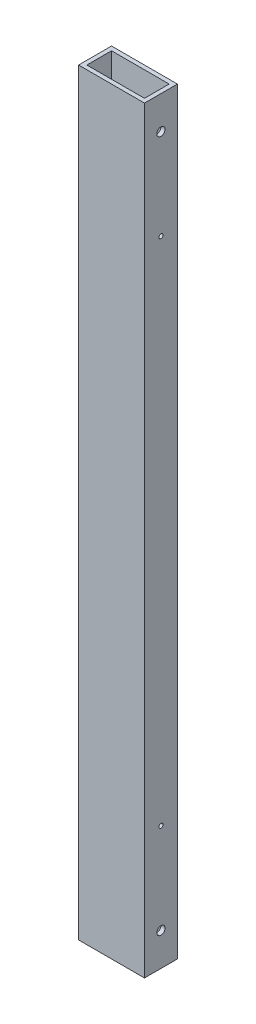
ISO-10303-21;
HEADER;
FILE_DESCRIPTION(('STEP AP214'),'2;1');
FILE_NAME('part.step','',(''),(''),'','','');
FILE_SCHEMA(('AUTOMOTIVE_DESIGN { 1 0 10303 214 1 1 1 1 }'));
ENDSEC;
DATA;
#1=APPLICATION_CONTEXT('core data for automotive mechanical design processes');
#2=APPLICATION_PROTOCOL_DEFINITION('international standard','automotive_design',2000,#1);
#3=PRODUCT_CONTEXT('',#1,'mechanical');
#4=PRODUCT('Part','Part','',(#3));
#5=PRODUCT_RELATED_PRODUCT_CATEGORY('part','',(#4));
#6=PRODUCT_DEFINITION_FORMATION('','',#4);
#7=PRODUCT_DEFINITION_CONTEXT('part definition',#1,'design');
#8=PRODUCT_DEFINITION('design','',#6,#7);
#9=PRODUCT_DEFINITION_SHAPE('','',#8);
#10=(LENGTH_UNIT() NAMED_UNIT(*) SI_UNIT(.MILLI.,.METRE.));
#11=(NAMED_UNIT(*) PLANE_ANGLE_UNIT() SI_UNIT($,.RADIAN.));
#12=(NAMED_UNIT(*) SI_UNIT($,.STERADIAN.) SOLID_ANGLE_UNIT());
#13=UNCERTAINTY_MEASURE_WITH_UNIT(LENGTH_MEASURE(1.E-05),#10,'distance_accuracy_value','');
#14=(GEOMETRIC_REPRESENTATION_CONTEXT(3) GLOBAL_UNCERTAINTY_ASSIGNED_CONTEXT((#13)) GLOBAL_UNIT_ASSIGNED_CONTEXT((#10,
#11,#12)) REPRESENTATION_CONTEXT('',''));
#15=CARTESIAN_POINT('',(0.,0.,0.));
#16=DIRECTION('',(0.,0.,1.));
#17=DIRECTION('',(1.,0.,0.));
#18=AXIS2_PLACEMENT_3D('',#15,#16,#17);
#19=CARTESIAN_POINT('',(0.,584.2,0.));
#20=DIRECTION('',(0.,-1.,0.));
#21=DIRECTION('',(0.,0.,-1.));
#22=AXIS2_PLACEMENT_3D('',#19,#20,#21);
#23=PLANE('',#22);
#24=DIRECTION('',(0.,0.,1.));
#25=VECTOR('',#24,1.);
#26=CARTESIAN_POINT('',(-3.175,584.2,3.175));
#27=LINE('',#26,#25);
#28=CARTESIAN_POINT('',(-3.175,584.2,-22.225));
#29=VERTEX_POINT('',#28);
#30=CARTESIAN_POINT('',(-3.175,584.2,3.175));
#31=VERTEX_POINT('',#30);
#32=EDGE_CURVE('E137',#29,#31,#27,.T.);
#33=ORIENTED_EDGE('',*,*,#32,.T.);
#34=DIRECTION('',(1.,0.,0.));
#35=VECTOR('',#34,1.);
#36=CARTESIAN_POINT('',(-3.175,584.2,3.175));
#37=LINE('',#36,#35);
#38=CARTESIAN_POINT('',(47.625,584.2,3.175));
#39=VERTEX_POINT('',#38);
#40=EDGE_CURVE('E140',#31,#39,#37,.T.);
#41=ORIENTED_EDGE('',*,*,#40,.T.);
#42=DIRECTION('',(0.,0.,-1.));
#43=VECTOR('',#42,1.);
#44=CARTESIAN_POINT('',(47.625,584.2,3.175));
#45=LINE('',#44,#43);
#46=CARTESIAN_POINT('',(47.625,584.2,-22.225));
#47=VERTEX_POINT('',#46);
#48=EDGE_CURVE('E143',#39,#47,#45,.T.);
#49=ORIENTED_EDGE('',*,*,#48,.T.);
#50=DIRECTION('',(-1.,0.,0.));
#51=VECTOR('',#50,1.);
#52=CARTESIAN_POINT('',(-3.175,584.2,-22.225));
#53=LINE('',#52,#51);
#54=EDGE_CURVE('E145',#47,#29,#53,.T.);
#55=ORIENTED_EDGE('',*,*,#54,.T.);
#56=EDGE_LOOP('',(#33,#41,#49,#55));
#57=FACE_BOUND('',#56,.T.);
#58=DIRECTION('',(0.,0.,1.));
#59=VECTOR('',#58,1.);
#60=CARTESIAN_POINT('',(0.,584.2,0.));
#61=LINE('',#60,#59);
#62=CARTESIAN_POINT('',(0.,584.2,-19.05));
#63=VERTEX_POINT('',#62);
#64=CARTESIAN_POINT('',(0.,584.2,0.));
#65=VERTEX_POINT('',#64);
#66=EDGE_CURVE('E99',#63,#65,#61,.T.);
#67=ORIENTED_EDGE('',*,*,#66,.F.);
#68=DIRECTION('',(-1.,0.,0.));
#69=VECTOR('',#68,1.);
#70=CARTESIAN_POINT('',(0.,584.2,-19.05));
#71=LINE('',#70,#69);
#72=CARTESIAN_POINT('',(44.45,584.2,-19.05));
#73=VERTEX_POINT('',#72);
#74=EDGE_CURVE('E121',#73,#63,#71,.T.);
#75=ORIENTED_EDGE('',*,*,#74,.F.);
#76=DIRECTION('',(0.,0.,-1.));
#77=VECTOR('',#76,1.);
#78=CARTESIAN_POINT('',(44.45,584.2,0.));
#79=LINE('',#78,#77);
#80=CARTESIAN_POINT('',(44.45,584.2,0.));
#81=VERTEX_POINT('',#80);
#82=EDGE_CURVE('E119',#81,#73,#79,.T.);
#83=ORIENTED_EDGE('',*,*,#82,.F.);
#84=DIRECTION('',(1.,0.,0.));
#85=VECTOR('',#84,1.);
#86=CARTESIAN_POINT('',(0.,584.2,0.));
#87=LINE('',#86,#85);
#88=EDGE_CURVE('E107',#65,#81,#87,.T.);
#89=ORIENTED_EDGE('',*,*,#88,.F.);
#90=EDGE_LOOP('',(#67,#75,#83,#89));
#91=FACE_BOUND('',#90,.T.);
#92=ADVANCED_FACE('F32',(#57,#91),#23,.F.);
#93=CARTESIAN_POINT('',(0.,0.,0.));
#94=DIRECTION('',(0.,-1.,0.));
#95=DIRECTION('',(0.,0.,-1.));
#96=AXIS2_PLACEMENT_3D('',#93,#94,#95);
#97=PLANE('',#96);
#98=DIRECTION('',(0.,0.,1.));
#99=VECTOR('',#98,1.);
#100=CARTESIAN_POINT('',(-3.175,0.,3.175));
#101=LINE('',#100,#99);
#102=CARTESIAN_POINT('',(-3.175,0.,-22.225));
#103=VERTEX_POINT('',#102);
#104=CARTESIAN_POINT('',(-3.175,0.,3.175));
#105=VERTEX_POINT('',#104);
#106=EDGE_CURVE('E115',#103,#105,#101,.T.);
#107=ORIENTED_EDGE('',*,*,#106,.F.);
#108=DIRECTION('',(-1.,0.,0.));
#109=VECTOR('',#108,1.);
#110=CARTESIAN_POINT('',(-3.175,0.,-22.225));
#111=LINE('',#110,#109);
#112=CARTESIAN_POINT('',(47.625,0.,-22.225));
#113=VERTEX_POINT('',#112);
#114=EDGE_CURVE('E141',#113,#103,#111,.T.);
#115=ORIENTED_EDGE('',*,*,#114,.F.);
#116=DIRECTION('',(0.,0.,-1.));
#117=VECTOR('',#116,1.);
#118=CARTESIAN_POINT('',(47.625,0.,3.175));
#119=LINE('',#118,#117);
#120=CARTESIAN_POINT('',(47.625,0.,3.175));
#121=VERTEX_POINT('',#120);
#122=EDGE_CURVE('E152',#121,#113,#119,.T.);
#123=ORIENTED_EDGE('',*,*,#122,.F.);
#124=DIRECTION('',(1.,0.,0.));
#125=VECTOR('',#124,1.);
#126=CARTESIAN_POINT('',(-3.175,0.,3.175));
#127=LINE('',#126,#125);
#128=EDGE_CURVE('E150',#105,#121,#127,.T.);
#129=ORIENTED_EDGE('',*,*,#128,.F.);
#130=EDGE_LOOP('',(#107,#115,#123,#129));
#131=FACE_BOUND('',#130,.T.);
#132=DIRECTION('',(-1.,0.,0.));
#133=VECTOR('',#132,1.);
#134=CARTESIAN_POINT('',(0.,0.,-19.05));
#135=LINE('',#134,#133);
#136=CARTESIAN_POINT('',(44.45,0.,-19.05));
#137=VERTEX_POINT('',#136);
#138=CARTESIAN_POINT('',(0.,0.,-19.05));
#139=VERTEX_POINT('',#138);
#140=EDGE_CURVE('E108',#137,#139,#135,.T.);
#141=ORIENTED_EDGE('',*,*,#140,.T.);
#142=DIRECTION('',(0.,0.,1.));
#143=VECTOR('',#142,1.);
#144=CARTESIAN_POINT('',(0.,0.,0.));
#145=LINE('',#144,#143);
#146=CARTESIAN_POINT('',(0.,0.,0.));
#147=VERTEX_POINT('',#146);
#148=EDGE_CURVE('E57',#139,#147,#145,.T.);
#149=ORIENTED_EDGE('',*,*,#148,.T.);
#150=DIRECTION('',(1.,0.,0.));
#151=VECTOR('',#150,1.);
#152=CARTESIAN_POINT('',(0.,0.,0.));
#153=LINE('',#152,#151);
#154=CARTESIAN_POINT('',(44.45,0.,0.));
#155=VERTEX_POINT('',#154);
#156=EDGE_CURVE('E114',#147,#155,#153,.T.);
#157=ORIENTED_EDGE('',*,*,#156,.T.);
#158=DIRECTION('',(0.,0.,-1.));
#159=VECTOR('',#158,1.);
#160=CARTESIAN_POINT('',(44.45,0.,0.));
#161=LINE('',#160,#159);
#162=EDGE_CURVE('E129',#155,#137,#161,.T.);
#163=ORIENTED_EDGE('',*,*,#162,.T.);
#164=EDGE_LOOP('',(#141,#149,#157,#163));
#165=FACE_BOUND('',#164,.T.);
#166=ADVANCED_FACE('F225',(#131,#165),#97,.T.);
#167=CARTESIAN_POINT('',(-3.175,584.2,3.175));
#168=DIRECTION('',(1.,0.,0.));
#169=DIRECTION('',(0.,0.,-1.));
#170=AXIS2_PLACEMENT_3D('',#167,#168,#169);
#171=PLANE('',#170);
#172=CARTESIAN_POINT('',(-3.175,558.8,-9.525));
#173=DIRECTION('',(-1.,0.,0.));
#174=DIRECTION('',(0.,0.,1.));
#175=AXIS2_PLACEMENT_3D('',#172,#173,#174);
#176=CIRCLE('',#175,3.175);
#177=CARTESIAN_POINT('',(-3.175,558.8,-6.35));
#178=VERTEX_POINT('',#177);
#179=EDGE_CURVE('E295',#178,#178,#176,.T.);
#180=ORIENTED_EDGE('',*,*,#179,.F.);
#181=EDGE_LOOP('',(#180));
#182=FACE_BOUND('',#181,.T.);
#183=CARTESIAN_POINT('',(-3.175,25.4,-9.525));
#184=DIRECTION('',(-1.,0.,0.));
#185=DIRECTION('',(0.,0.,1.));
#186=AXIS2_PLACEMENT_3D('',#183,#184,#185);
#187=CIRCLE('',#186,3.175);
#188=CARTESIAN_POINT('',(-3.175,25.4,-6.35));
#189=VERTEX_POINT('',#188);
#190=EDGE_CURVE('E180',#189,#189,#187,.T.);
#191=ORIENTED_EDGE('',*,*,#190,.F.);
#192=EDGE_LOOP('',(#191));
#193=FACE_BOUND('',#192,.T.);
#194=CARTESIAN_POINT('',(-3.175,488.95,-9.52500000000001));
#195=DIRECTION('',(1.,0.,0.));
#196=DIRECTION('',(0.,0.,-1.));
#197=AXIS2_PLACEMENT_3D('',#194,#195,#196);
#198=CIRCLE('',#197,1.58750000000004);
#199=CARTESIAN_POINT('',(-3.175,488.95,-11.1125));
#200=VERTEX_POINT('',#199);
#201=EDGE_CURVE('E169',#200,#200,#198,.T.);
#202=ORIENTED_EDGE('',*,*,#201,.T.);
#203=EDGE_LOOP('',(#202));
#204=FACE_BOUND('',#203,.T.);
#205=CARTESIAN_POINT('',(-3.175,95.2500000000001,-9.52499999999995));
#206=DIRECTION('',(1.,0.,0.));
#207=DIRECTION('',(0.,0.,-1.));
#208=AXIS2_PLACEMENT_3D('',#205,#206,#207);
#209=CIRCLE('',#208,1.58750000000005);
#210=CARTESIAN_POINT('',(-3.175,95.2500000000001,-11.1125));
#211=VERTEX_POINT('',#210);
#212=EDGE_CURVE('E165',#211,#211,#209,.T.);
#213=ORIENTED_EDGE('',*,*,#212,.T.);
#214=EDGE_LOOP('',(#213));
#215=FACE_BOUND('',#214,.T.);
#216=ORIENTED_EDGE('',*,*,#106,.T.);
#217=DIRECTION('',(0.,-1.,0.));
#218=VECTOR('',#217,1.);
#219=CARTESIAN_POINT('',(-3.175,584.2,3.175));
#220=LINE('',#219,#218);
#221=EDGE_CURVE('E11',#31,#105,#220,.T.);
#222=ORIENTED_EDGE('',*,*,#221,.F.);
#223=ORIENTED_EDGE('',*,*,#32,.F.);
#224=DIRECTION('',(0.,-1.,0.));
#225=VECTOR('',#224,1.);
#226=CARTESIAN_POINT('',(-3.175,584.2,-22.225));
#227=LINE('',#226,#225);
#228=EDGE_CURVE('E147',#29,#103,#227,.T.);
#229=ORIENTED_EDGE('',*,*,#228,.T.);
#230=EDGE_LOOP('',(#216,#222,#223,#229));
#231=FACE_BOUND('',#230,.T.);
#232=ADVANCED_FACE('F34',(#182,#193,#204,#215,#231),#171,.F.);
#233=CARTESIAN_POINT('',(-3.175,584.2,3.175));
#234=DIRECTION('',(0.,0.,-1.));
#235=DIRECTION('',(-1.,0.,0.));
#236=AXIS2_PLACEMENT_3D('',#233,#234,#235);
#237=PLANE('',#236);
#238=ORIENTED_EDGE('',*,*,#128,.T.);
#239=DIRECTION('',(0.,-1.,0.));
#240=VECTOR('',#239,1.);
#241=CARTESIAN_POINT('',(47.625,584.2,3.175));
#242=LINE('',#241,#240);
#243=EDGE_CURVE('E41',#39,#121,#242,.T.);
#244=ORIENTED_EDGE('',*,*,#243,.F.);
#245=ORIENTED_EDGE('',*,*,#40,.F.);
#246=ORIENTED_EDGE('',*,*,#221,.T.);
#247=EDGE_LOOP('',(#238,#244,#245,#246));
#248=FACE_BOUND('',#247,.T.);
#249=ADVANCED_FACE('F233',(#248),#237,.F.);
#250=CARTESIAN_POINT('',(47.625,584.2,3.175));
#251=DIRECTION('',(-1.,0.,0.));
#252=DIRECTION('',(0.,0.,1.));
#253=AXIS2_PLACEMENT_3D('',#250,#251,#252);
#254=PLANE('',#253);
#255=CARTESIAN_POINT('',(47.625,558.8,-9.525));
#256=DIRECTION('',(-1.,0.,0.));
#257=DIRECTION('',(0.,0.,1.));
#258=AXIS2_PLACEMENT_3D('',#255,#256,#257);
#259=CIRCLE('',#258,3.175);
#260=CARTESIAN_POINT('',(47.625,558.8,-6.35));
#261=VERTEX_POINT('',#260);
#262=EDGE_CURVE('E294',#261,#261,#259,.T.);
#263=ORIENTED_EDGE('',*,*,#262,.T.);
#264=EDGE_LOOP('',(#263));
#265=FACE_BOUND('',#264,.T.);
#266=CARTESIAN_POINT('',(47.625,25.4,-9.525));
#267=DIRECTION('',(-1.,0.,0.));
#268=DIRECTION('',(0.,0.,1.));
#269=AXIS2_PLACEMENT_3D('',#266,#267,#268);
#270=CIRCLE('',#269,3.175);
#271=CARTESIAN_POINT('',(47.625,25.4,-6.35));
#272=VERTEX_POINT('',#271);
#273=EDGE_CURVE('E173',#272,#272,#270,.T.);
#274=ORIENTED_EDGE('',*,*,#273,.T.);
#275=EDGE_LOOP('',(#274));
#276=FACE_BOUND('',#275,.T.);
#277=CARTESIAN_POINT('',(47.625,488.95,-9.52500000000001));
#278=DIRECTION('',(1.,0.,0.));
#279=DIRECTION('',(0.,0.,-1.));
#280=AXIS2_PLACEMENT_3D('',#277,#278,#279);
#281=CIRCLE('',#280,1.58750000000004);
#282=CARTESIAN_POINT('',(47.625,488.95,-11.1125));
#283=VERTEX_POINT('',#282);
#284=EDGE_CURVE('E177',#283,#283,#281,.T.);
#285=ORIENTED_EDGE('',*,*,#284,.F.);
#286=EDGE_LOOP('',(#285));
#287=FACE_BOUND('',#286,.T.);
#288=CARTESIAN_POINT('',(47.625,95.2500000000001,-9.52499999999995));
#289=DIRECTION('',(1.,0.,0.));
#290=DIRECTION('',(0.,0.,-1.));
#291=AXIS2_PLACEMENT_3D('',#288,#289,#290);
#292=CIRCLE('',#291,1.58750000000005);
#293=CARTESIAN_POINT('',(47.625,95.2500000000001,-11.1125));
#294=VERTEX_POINT('',#293);
#295=EDGE_CURVE('E196',#294,#294,#292,.T.);
#296=ORIENTED_EDGE('',*,*,#295,.F.);
#297=EDGE_LOOP('',(#296));
#298=FACE_BOUND('',#297,.T.);
#299=ORIENTED_EDGE('',*,*,#122,.T.);
#300=DIRECTION('',(0.,-1.,0.));
#301=VECTOR('',#300,1.);
#302=CARTESIAN_POINT('',(47.625,584.2,-22.225));
#303=LINE('',#302,#301);
#304=EDGE_CURVE('E157',#47,#113,#303,.T.);
#305=ORIENTED_EDGE('',*,*,#304,.F.);
#306=ORIENTED_EDGE('',*,*,#48,.F.);
#307=ORIENTED_EDGE('',*,*,#243,.T.);
#308=EDGE_LOOP('',(#299,#305,#306,#307));
#309=FACE_BOUND('',#308,.T.);
#310=ADVANCED_FACE('F218',(#265,#276,#287,#298,#309),#254,.F.);
#311=CARTESIAN_POINT('',(-3.175,584.2,-22.225));
#312=DIRECTION('',(0.,0.,1.));
#313=DIRECTION('',(1.,0.,0.));
#314=AXIS2_PLACEMENT_3D('',#311,#312,#313);
#315=PLANE('',#314);
#316=ORIENTED_EDGE('',*,*,#114,.T.);
#317=ORIENTED_EDGE('',*,*,#228,.F.);
#318=ORIENTED_EDGE('',*,*,#54,.F.);
#319=ORIENTED_EDGE('',*,*,#304,.T.);
#320=EDGE_LOOP('',(#316,#317,#318,#319));
#321=FACE_BOUND('',#320,.T.);
#322=ADVANCED_FACE('F207',(#321),#315,.F.);
#323=CARTESIAN_POINT('',(0.,584.2,0.));
#324=DIRECTION('',(1.,0.,0.));
#325=DIRECTION('',(0.,0.,-1.));
#326=AXIS2_PLACEMENT_3D('',#323,#324,#325);
#327=PLANE('',#326);
#328=CARTESIAN_POINT('',(0.,558.8,-9.525));
#329=DIRECTION('',(1.,0.,0.));
#330=DIRECTION('',(0.,0.,-1.));
#331=AXIS2_PLACEMENT_3D('',#328,#329,#330);
#332=CIRCLE('',#331,3.175);
#333=CARTESIAN_POINT('',(0.,558.8,-12.7));
#334=VERTEX_POINT('',#333);
#335=EDGE_CURVE('E185',#334,#334,#332,.T.);
#336=ORIENTED_EDGE('',*,*,#335,.F.);
#337=EDGE_LOOP('',(#336));
#338=FACE_BOUND('',#337,.T.);
#339=CARTESIAN_POINT('',(0.,25.4,-9.525));
#340=DIRECTION('',(1.,0.,0.));
#341=DIRECTION('',(0.,0.,-1.));
#342=AXIS2_PLACEMENT_3D('',#339,#340,#341);
#343=CIRCLE('',#342,3.175);
#344=CARTESIAN_POINT('',(0.,25.4,-12.7));
#345=VERTEX_POINT('',#344);
#346=EDGE_CURVE('E172',#345,#345,#343,.T.);
#347=ORIENTED_EDGE('',*,*,#346,.F.);
#348=EDGE_LOOP('',(#347));
#349=FACE_BOUND('',#348,.T.);
#350=CARTESIAN_POINT('',(0.,488.95,-9.52500000000001));
#351=DIRECTION('',(1.,0.,0.));
#352=DIRECTION('',(0.,0.,-1.));
#353=AXIS2_PLACEMENT_3D('',#350,#351,#352);
#354=CIRCLE('',#353,1.58750000000004);
#355=CARTESIAN_POINT('',(0.,488.95,-11.1125));
#356=VERTEX_POINT('',#355);
#357=EDGE_CURVE('E168',#356,#356,#354,.T.);
#358=ORIENTED_EDGE('',*,*,#357,.F.);
#359=EDGE_LOOP('',(#358));
#360=FACE_BOUND('',#359,.T.);
#361=CARTESIAN_POINT('',(0.,95.2500000000001,-9.52499999999995));
#362=DIRECTION('',(1.,0.,0.));
#363=DIRECTION('',(0.,0.,-1.));
#364=AXIS2_PLACEMENT_3D('',#361,#362,#363);
#365=CIRCLE('',#364,1.58750000000005);
#366=CARTESIAN_POINT('',(0.,95.2500000000001,-11.1125));
#367=VERTEX_POINT('',#366);
#368=EDGE_CURVE('E127',#367,#367,#365,.T.);
#369=ORIENTED_EDGE('',*,*,#368,.F.);
#370=EDGE_LOOP('',(#369));
#371=FACE_BOUND('',#370,.T.);
#372=ORIENTED_EDGE('',*,*,#148,.F.);
#373=DIRECTION('',(0.,-1.,0.));
#374=VECTOR('',#373,1.);
#375=CARTESIAN_POINT('',(0.,584.2,-19.05));
#376=LINE('',#375,#374);
#377=EDGE_CURVE('E103',#63,#139,#376,.T.);
#378=ORIENTED_EDGE('',*,*,#377,.F.);
#379=ORIENTED_EDGE('',*,*,#66,.T.);
#380=DIRECTION('',(0.,-1.,0.));
#381=VECTOR('',#380,1.);
#382=CARTESIAN_POINT('',(0.,584.2,0.));
#383=LINE('',#382,#381);
#384=EDGE_CURVE('E102',#65,#147,#383,.T.);
#385=ORIENTED_EDGE('',*,*,#384,.T.);
#386=EDGE_LOOP('',(#372,#378,#379,#385));
#387=FACE_BOUND('',#386,.T.);
#388=ADVANCED_FACE('F101',(#338,#349,#360,#371,#387),#327,.T.);
#389=CARTESIAN_POINT('',(0.,584.2,0.));
#390=DIRECTION('',(0.,0.,-1.));
#391=DIRECTION('',(-1.,0.,0.));
#392=AXIS2_PLACEMENT_3D('',#389,#390,#391);
#393=PLANE('',#392);
#394=ORIENTED_EDGE('',*,*,#156,.F.);
#395=ORIENTED_EDGE('',*,*,#384,.F.);
#396=ORIENTED_EDGE('',*,*,#88,.T.);
#397=DIRECTION('',(0.,-1.,0.));
#398=VECTOR('',#397,1.);
#399=CARTESIAN_POINT('',(44.45,584.2,0.));
#400=LINE('',#399,#398);
#401=EDGE_CURVE('E116',#81,#155,#400,.T.);
#402=ORIENTED_EDGE('',*,*,#401,.T.);
#403=EDGE_LOOP('',(#394,#395,#396,#402));
#404=FACE_BOUND('',#403,.T.);
#405=ADVANCED_FACE('F111',(#404),#393,.T.);
#406=CARTESIAN_POINT('',(44.45,584.2,0.));
#407=DIRECTION('',(-1.,0.,0.));
#408=DIRECTION('',(0.,0.,1.));
#409=AXIS2_PLACEMENT_3D('',#406,#407,#408);
#410=PLANE('',#409);
#411=CARTESIAN_POINT('',(44.45,558.8,-9.525));
#412=DIRECTION('',(-1.,0.,0.));
#413=DIRECTION('',(0.,0.,1.));
#414=AXIS2_PLACEMENT_3D('',#411,#412,#413);
#415=CIRCLE('',#414,3.175);
#416=CARTESIAN_POINT('',(44.45,558.8,-6.35));
#417=VERTEX_POINT('',#416);
#418=EDGE_CURVE('E36',#417,#417,#415,.T.);
#419=ORIENTED_EDGE('',*,*,#418,.F.);
#420=EDGE_LOOP('',(#419));
#421=FACE_BOUND('',#420,.T.);
#422=CARTESIAN_POINT('',(44.45,25.4,-9.525));
#423=DIRECTION('',(-1.,0.,0.));
#424=DIRECTION('',(0.,0.,1.));
#425=AXIS2_PLACEMENT_3D('',#422,#423,#424);
#426=CIRCLE('',#425,3.175);
#427=CARTESIAN_POINT('',(44.45,25.4,-6.35));
#428=VERTEX_POINT('',#427);
#429=EDGE_CURVE('E170',#428,#428,#426,.T.);
#430=ORIENTED_EDGE('',*,*,#429,.F.);
#431=EDGE_LOOP('',(#430));
#432=FACE_BOUND('',#431,.T.);
#433=CARTESIAN_POINT('',(44.45,488.95,-9.52500000000001));
#434=DIRECTION('',(-1.,0.,0.));
#435=DIRECTION('',(0.,0.,1.));
#436=AXIS2_PLACEMENT_3D('',#433,#434,#435);
#437=CIRCLE('',#436,1.58750000000004);
#438=CARTESIAN_POINT('',(44.45,488.95,-7.93749999999997));
#439=VERTEX_POINT('',#438);
#440=EDGE_CURVE('E166',#439,#439,#437,.T.);
#441=ORIENTED_EDGE('',*,*,#440,.F.);
#442=EDGE_LOOP('',(#441));
#443=FACE_BOUND('',#442,.T.);
#444=CARTESIAN_POINT('',(44.45,95.2500000000001,-9.52499999999995));
#445=DIRECTION('',(-1.,0.,0.));
#446=DIRECTION('',(0.,0.,1.));
#447=AXIS2_PLACEMENT_3D('',#444,#445,#446);
#448=CIRCLE('',#447,1.58750000000005);
#449=CARTESIAN_POINT('',(44.45,95.2500000000001,-7.9374999999999));
#450=VERTEX_POINT('',#449);
#451=EDGE_CURVE('E162',#450,#450,#448,.T.);
#452=ORIENTED_EDGE('',*,*,#451,.F.);
#453=EDGE_LOOP('',(#452));
#454=FACE_BOUND('',#453,.T.);
#455=ORIENTED_EDGE('',*,*,#162,.F.);
#456=ORIENTED_EDGE('',*,*,#401,.F.);
#457=ORIENTED_EDGE('',*,*,#82,.T.);
#458=DIRECTION('',(0.,-1.,0.));
#459=VECTOR('',#458,1.);
#460=CARTESIAN_POINT('',(44.45,584.2,-19.05));
#461=LINE('',#460,#459);
#462=EDGE_CURVE('E49',#73,#137,#461,.T.);
#463=ORIENTED_EDGE('',*,*,#462,.T.);
#464=EDGE_LOOP('',(#455,#456,#457,#463));
#465=FACE_BOUND('',#464,.T.);
#466=ADVANCED_FACE('F215',(#421,#432,#443,#454,#465),#410,.T.);
#467=CARTESIAN_POINT('',(0.,584.2,-19.05));
#468=DIRECTION('',(0.,0.,1.));
#469=DIRECTION('',(1.,0.,0.));
#470=AXIS2_PLACEMENT_3D('',#467,#468,#469);
#471=PLANE('',#470);
#472=ORIENTED_EDGE('',*,*,#140,.F.);
#473=ORIENTED_EDGE('',*,*,#462,.F.);
#474=ORIENTED_EDGE('',*,*,#74,.T.);
#475=ORIENTED_EDGE('',*,*,#377,.T.);
#476=EDGE_LOOP('',(#472,#473,#474,#475));
#477=FACE_BOUND('',#476,.T.);
#478=ADVANCED_FACE('F257',(#477),#471,.T.);
#479=CARTESIAN_POINT('',(-3.175,95.2500000000001,-9.52499999999995));
#480=DIRECTION('',(1.,0.,0.));
#481=DIRECTION('',(0.,0.,-1.));
#482=AXIS2_PLACEMENT_3D('',#479,#480,#481);
#483=CYLINDRICAL_SURFACE('',#482,1.58750000000005);
#484=ORIENTED_EDGE('',*,*,#451,.T.);
#485=EDGE_LOOP('',(#484));
#486=FACE_BOUND('',#485,.T.);
#487=ORIENTED_EDGE('',*,*,#295,.T.);
#488=EDGE_LOOP('',(#487));
#489=FACE_BOUND('',#488,.T.);
#490=ADVANCED_FACE('F259',(#486,#489),#483,.F.);
#491=ORIENTED_EDGE('',*,*,#368,.T.);
#492=EDGE_LOOP('',(#491));
#493=FACE_BOUND('',#492,.T.);
#494=ORIENTED_EDGE('',*,*,#212,.F.);
#495=EDGE_LOOP('',(#494));
#496=FACE_BOUND('',#495,.T.);
#497=ADVANCED_FACE('F203',(#493,#496),#483,.F.);
#498=CARTESIAN_POINT('',(-3.175,488.95,-9.52500000000001));
#499=DIRECTION('',(1.,0.,0.));
#500=DIRECTION('',(0.,0.,-1.));
#501=AXIS2_PLACEMENT_3D('',#498,#499,#500);
#502=CYLINDRICAL_SURFACE('',#501,1.58750000000004);
#503=ORIENTED_EDGE('',*,*,#440,.T.);
#504=EDGE_LOOP('',(#503));
#505=FACE_BOUND('',#504,.T.);
#506=ORIENTED_EDGE('',*,*,#284,.T.);
#507=EDGE_LOOP('',(#506));
#508=FACE_BOUND('',#507,.T.);
#509=ADVANCED_FACE('F270',(#505,#508),#502,.F.);
#510=ORIENTED_EDGE('',*,*,#357,.T.);
#511=EDGE_LOOP('',(#510));
#512=FACE_BOUND('',#511,.T.);
#513=ORIENTED_EDGE('',*,*,#201,.F.);
#514=EDGE_LOOP('',(#513));
#515=FACE_BOUND('',#514,.T.);
#516=ADVANCED_FACE('F273',(#512,#515),#502,.F.);
#517=CARTESIAN_POINT('',(47.625,25.4,-9.525));
#518=DIRECTION('',(-1.,0.,0.));
#519=DIRECTION('',(0.,0.,1.));
#520=AXIS2_PLACEMENT_3D('',#517,#518,#519);
#521=CYLINDRICAL_SURFACE('',#520,3.175);
#522=ORIENTED_EDGE('',*,*,#429,.T.);
#523=EDGE_LOOP('',(#522));
#524=FACE_BOUND('',#523,.T.);
#525=ORIENTED_EDGE('',*,*,#273,.F.);
#526=EDGE_LOOP('',(#525));
#527=FACE_BOUND('',#526,.T.);
#528=ADVANCED_FACE('F275',(#524,#527),#521,.F.);
#529=ORIENTED_EDGE('',*,*,#346,.T.);
#530=EDGE_LOOP('',(#529));
#531=FACE_BOUND('',#530,.T.);
#532=ORIENTED_EDGE('',*,*,#190,.T.);
#533=EDGE_LOOP('',(#532));
#534=FACE_BOUND('',#533,.T.);
#535=ADVANCED_FACE('F278',(#531,#534),#521,.F.);
#536=CARTESIAN_POINT('',(47.625,558.8,-9.525));
#537=DIRECTION('',(-1.,0.,0.));
#538=DIRECTION('',(0.,0.,1.));
#539=AXIS2_PLACEMENT_3D('',#536,#537,#538);
#540=CYLINDRICAL_SURFACE('',#539,3.175);
#541=ORIENTED_EDGE('',*,*,#418,.T.);
#542=EDGE_LOOP('',(#541));
#543=FACE_BOUND('',#542,.T.);
#544=ORIENTED_EDGE('',*,*,#262,.F.);
#545=EDGE_LOOP('',(#544));
#546=FACE_BOUND('',#545,.T.);
#547=ADVANCED_FACE('F279',(#543,#546),#540,.F.);
#548=ORIENTED_EDGE('',*,*,#335,.T.);
#549=EDGE_LOOP('',(#548));
#550=FACE_BOUND('',#549,.T.);
#551=ORIENTED_EDGE('',*,*,#179,.T.);
#552=EDGE_LOOP('',(#551));
#553=FACE_BOUND('',#552,.T.);
#554=ADVANCED_FACE('F281',(#550,#553),#540,.F.);
#555=CLOSED_SHELL('',(#92,#166,#232,#249,#310,#322,#388,#405,#466,#478,#490,#497,#509,#516,#528,
#535,#547,#554));
#556=MANIFOLD_SOLID_BREP('B2',#555);
#557=ADVANCED_BREP_SHAPE_REPRESENTATION('',(#18,#556),#14);
#558=SHAPE_DEFINITION_REPRESENTATION(#9,#557);
ENDSEC;
END-ISO-10303-21;
